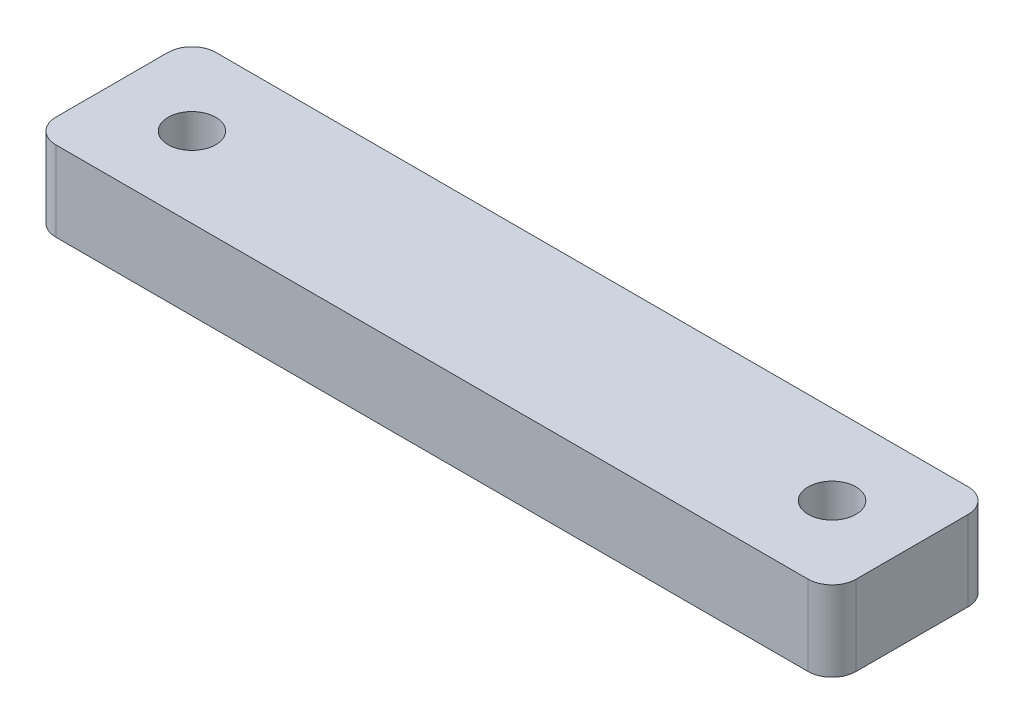
ISO-10303-21;
HEADER;
FILE_DESCRIPTION(('STEP AP214'),'2;1');
FILE_NAME('part.step','',(''),(''),'','','');
FILE_SCHEMA(('AUTOMOTIVE_DESIGN { 1 0 10303 214 1 1 1 1 }'));
ENDSEC;
DATA;
#1=APPLICATION_CONTEXT('core data for automotive mechanical design processes');
#2=APPLICATION_PROTOCOL_DEFINITION('international standard','automotive_design',2000,#1);
#3=PRODUCT_CONTEXT('',#1,'mechanical');
#4=PRODUCT('Part','Part','',(#3));
#5=PRODUCT_RELATED_PRODUCT_CATEGORY('part','',(#4));
#6=PRODUCT_DEFINITION_FORMATION('','',#4);
#7=PRODUCT_DEFINITION_CONTEXT('part definition',#1,'design');
#8=PRODUCT_DEFINITION('design','',#6,#7);
#9=PRODUCT_DEFINITION_SHAPE('','',#8);
#10=(LENGTH_UNIT() NAMED_UNIT(*) SI_UNIT(.MILLI.,.METRE.));
#11=(NAMED_UNIT(*) PLANE_ANGLE_UNIT() SI_UNIT($,.RADIAN.));
#12=(NAMED_UNIT(*) SI_UNIT($,.STERADIAN.) SOLID_ANGLE_UNIT());
#13=UNCERTAINTY_MEASURE_WITH_UNIT(LENGTH_MEASURE(1.E-05),#10,'distance_accuracy_value','');
#14=(GEOMETRIC_REPRESENTATION_CONTEXT(3) GLOBAL_UNCERTAINTY_ASSIGNED_CONTEXT((#13)) GLOBAL_UNIT_ASSIGNED_CONTEXT((#10,
#11,#12)) REPRESENTATION_CONTEXT('',''));
#15=CARTESIAN_POINT('',(0.,0.,0.));
#16=DIRECTION('',(0.,0.,1.));
#17=DIRECTION('',(1.,0.,0.));
#18=AXIS2_PLACEMENT_3D('',#15,#16,#17);
#19=CARTESIAN_POINT('',(123.19,12.7,-3.81));
#20=DIRECTION('',(0.,-1.,0.));
#21=DIRECTION('',(0.,0.,-1.));
#22=AXIS2_PLACEMENT_3D('',#19,#20,#21);
#23=PLANE('',#22);
#24=CARTESIAN_POINT('',(12.7,12.7,-12.7));
#25=DIRECTION('',(0.,1.,0.));
#26=DIRECTION('',(0.,0.,1.));
#27=AXIS2_PLACEMENT_3D('',#24,#25,#26);
#28=CIRCLE('',#27,3.781980970317);
#29=CARTESIAN_POINT('',(12.7,12.7,-8.91801902968301));
#30=VERTEX_POINT('',#29);
#31=EDGE_CURVE('E134',#30,#30,#28,.T.);
#32=ORIENTED_EDGE('',*,*,#31,.F.);
#33=EDGE_LOOP('',(#32));
#34=FACE_BOUND('',#33,.T.);
#35=CARTESIAN_POINT('',(123.19,12.7,-3.81));
#36=DIRECTION('',(0.,1.,0.));
#37=DIRECTION('',(0.,0.,-1.));
#38=AXIS2_PLACEMENT_3D('',#35,#36,#37);
#39=CIRCLE('',#38,3.81);
#40=CARTESIAN_POINT('',(123.19,12.7,0.));
#41=VERTEX_POINT('',#40);
#42=CARTESIAN_POINT('',(127.,12.7,-3.81));
#43=VERTEX_POINT('',#42);
#44=EDGE_CURVE('E145',#41,#43,#39,.T.);
#45=ORIENTED_EDGE('',*,*,#44,.T.);
#46=DIRECTION('',(0.,0.,-1.));
#47=VECTOR('',#46,1.);
#48=CARTESIAN_POINT('',(127.,12.7,-3.81));
#49=LINE('',#48,#47);
#50=CARTESIAN_POINT('',(127.,12.7,-21.59));
#51=VERTEX_POINT('',#50);
#52=EDGE_CURVE('E93',#43,#51,#49,.T.);
#53=ORIENTED_EDGE('',*,*,#52,.T.);
#54=CARTESIAN_POINT('',(123.19,12.7,-21.59));
#55=DIRECTION('',(0.,1.,0.));
#56=DIRECTION('',(0.,0.,1.));
#57=AXIS2_PLACEMENT_3D('',#54,#55,#56);
#58=CIRCLE('',#57,3.81);
#59=CARTESIAN_POINT('',(123.19,12.7,-25.4));
#60=VERTEX_POINT('',#59);
#61=EDGE_CURVE('E160',#51,#60,#58,.T.);
#62=ORIENTED_EDGE('',*,*,#61,.T.);
#63=DIRECTION('',(-1.,0.,0.));
#64=VECTOR('',#63,1.);
#65=CARTESIAN_POINT('',(3.81000000000003,12.7,-25.4));
#66=LINE('',#65,#64);
#67=CARTESIAN_POINT('',(3.81000000000003,12.7,-25.4));
#68=VERTEX_POINT('',#67);
#69=EDGE_CURVE('E173',#60,#68,#66,.T.);
#70=ORIENTED_EDGE('',*,*,#69,.T.);
#71=CARTESIAN_POINT('',(3.81,12.7,-21.59));
#72=DIRECTION('',(0.,1.,0.));
#73=DIRECTION('',(0.,0.,1.));
#74=AXIS2_PLACEMENT_3D('',#71,#72,#73);
#75=CIRCLE('',#74,3.81);
#76=CARTESIAN_POINT('',(0.,12.7,-21.59));
#77=VERTEX_POINT('',#76);
#78=EDGE_CURVE('E112',#68,#77,#75,.T.);
#79=ORIENTED_EDGE('',*,*,#78,.T.);
#80=DIRECTION('',(0.,0.,1.));
#81=VECTOR('',#80,1.);
#82=CARTESIAN_POINT('',(0.,12.7,-3.81000000000003));
#83=LINE('',#82,#81);
#84=CARTESIAN_POINT('',(0.,12.7,-3.81000000000003));
#85=VERTEX_POINT('',#84);
#86=EDGE_CURVE('E106',#77,#85,#83,.T.);
#87=ORIENTED_EDGE('',*,*,#86,.T.);
#88=CARTESIAN_POINT('',(3.81,12.7,-3.81));
#89=DIRECTION('',(0.,1.,0.));
#90=DIRECTION('',(0.,0.,-1.));
#91=AXIS2_PLACEMENT_3D('',#88,#89,#90);
#92=CIRCLE('',#91,3.81);
#93=CARTESIAN_POINT('',(3.81000000000003,12.7,0.));
#94=VERTEX_POINT('',#93);
#95=EDGE_CURVE('E110',#85,#94,#92,.T.);
#96=ORIENTED_EDGE('',*,*,#95,.T.);
#97=DIRECTION('',(1.,0.,0.));
#98=VECTOR('',#97,1.);
#99=CARTESIAN_POINT('',(3.81000000000003,12.7,0.));
#100=LINE('',#99,#98);
#101=EDGE_CURVE('E50',#94,#41,#100,.T.);
#102=ORIENTED_EDGE('',*,*,#101,.T.);
#103=EDGE_LOOP('',(#45,#53,#62,#70,#79,#87,#96,#102));
#104=FACE_BOUND('',#103,.T.);
#105=CARTESIAN_POINT('',(114.3,12.7,-12.7));
#106=DIRECTION('',(0.,1.,0.));
#107=DIRECTION('',(0.,0.,1.));
#108=AXIS2_PLACEMENT_3D('',#105,#106,#107);
#109=CIRCLE('',#108,3.79092647156626);
#110=CARTESIAN_POINT('',(114.3,12.7,-8.90907352843374));
#111=VERTEX_POINT('',#110);
#112=EDGE_CURVE('E182',#111,#111,#109,.T.);
#113=ORIENTED_EDGE('',*,*,#112,.F.);
#114=EDGE_LOOP('',(#113));
#115=FACE_BOUND('',#114,.T.);
#116=ADVANCED_FACE('F33',(#34,#104,#115),#23,.F.);
#117=CARTESIAN_POINT('',(123.19,0.,-3.81));
#118=DIRECTION('',(0.,-1.,0.));
#119=DIRECTION('',(0.,0.,-1.));
#120=AXIS2_PLACEMENT_3D('',#117,#118,#119);
#121=PLANE('',#120);
#122=CARTESIAN_POINT('',(12.7,0.,-12.7));
#123=DIRECTION('',(0.,1.,0.));
#124=DIRECTION('',(0.,0.,1.));
#125=AXIS2_PLACEMENT_3D('',#122,#123,#124);
#126=CIRCLE('',#125,3.781980970317);
#127=CARTESIAN_POINT('',(12.7,0.,-8.91801902968301));
#128=VERTEX_POINT('',#127);
#129=EDGE_CURVE('E179',#128,#128,#126,.T.);
#130=ORIENTED_EDGE('',*,*,#129,.T.);
#131=EDGE_LOOP('',(#130));
#132=FACE_BOUND('',#131,.T.);
#133=CARTESIAN_POINT('',(123.19,0.,-3.81));
#134=DIRECTION('',(0.,1.,0.));
#135=DIRECTION('',(0.,0.,-1.));
#136=AXIS2_PLACEMENT_3D('',#133,#134,#135);
#137=CIRCLE('',#136,3.81);
#138=CARTESIAN_POINT('',(123.19,0.,0.));
#139=VERTEX_POINT('',#138);
#140=CARTESIAN_POINT('',(127.,0.,-3.81));
#141=VERTEX_POINT('',#140);
#142=EDGE_CURVE('E130',#139,#141,#137,.T.);
#143=ORIENTED_EDGE('',*,*,#142,.F.);
#144=DIRECTION('',(1.,0.,0.));
#145=VECTOR('',#144,1.);
#146=CARTESIAN_POINT('',(3.81000000000003,0.,0.));
#147=LINE('',#146,#145);
#148=CARTESIAN_POINT('',(3.81000000000003,0.,0.));
#149=VERTEX_POINT('',#148);
#150=EDGE_CURVE('E85',#149,#139,#147,.T.);
#151=ORIENTED_EDGE('',*,*,#150,.F.);
#152=CARTESIAN_POINT('',(3.81,0.,-3.81));
#153=DIRECTION('',(0.,1.,0.));
#154=DIRECTION('',(0.,0.,-1.));
#155=AXIS2_PLACEMENT_3D('',#152,#153,#154);
#156=CIRCLE('',#155,3.81);
#157=CARTESIAN_POINT('',(0.,0.,-3.81000000000003));
#158=VERTEX_POINT('',#157);
#159=EDGE_CURVE('E79',#158,#149,#156,.T.);
#160=ORIENTED_EDGE('',*,*,#159,.F.);
#161=DIRECTION('',(0.,0.,1.));
#162=VECTOR('',#161,1.);
#163=CARTESIAN_POINT('',(0.,0.,-3.81000000000003));
#164=LINE('',#163,#162);
#165=CARTESIAN_POINT('',(0.,0.,-21.59));
#166=VERTEX_POINT('',#165);
#167=EDGE_CURVE('E120',#166,#158,#164,.T.);
#168=ORIENTED_EDGE('',*,*,#167,.F.);
#169=CARTESIAN_POINT('',(3.81,0.,-21.59));
#170=DIRECTION('',(0.,1.,0.));
#171=DIRECTION('',(0.,0.,1.));
#172=AXIS2_PLACEMENT_3D('',#169,#170,#171);
#173=CIRCLE('',#172,3.81);
#174=CARTESIAN_POINT('',(3.81000000000003,0.,-25.4));
#175=VERTEX_POINT('',#174);
#176=EDGE_CURVE('E140',#175,#166,#173,.T.);
#177=ORIENTED_EDGE('',*,*,#176,.F.);
#178=DIRECTION('',(-1.,0.,0.));
#179=VECTOR('',#178,1.);
#180=CARTESIAN_POINT('',(3.81000000000003,0.,-25.4));
#181=LINE('',#180,#179);
#182=CARTESIAN_POINT('',(123.19,0.,-25.4));
#183=VERTEX_POINT('',#182);
#184=EDGE_CURVE('E138',#183,#175,#181,.T.);
#185=ORIENTED_EDGE('',*,*,#184,.F.);
#186=CARTESIAN_POINT('',(123.19,0.,-21.59));
#187=DIRECTION('',(0.,1.,0.));
#188=DIRECTION('',(0.,0.,1.));
#189=AXIS2_PLACEMENT_3D('',#186,#187,#188);
#190=CIRCLE('',#189,3.81);
#191=CARTESIAN_POINT('',(127.,0.,-21.59));
#192=VERTEX_POINT('',#191);
#193=EDGE_CURVE('E136',#192,#183,#190,.T.);
#194=ORIENTED_EDGE('',*,*,#193,.F.);
#195=DIRECTION('',(0.,0.,-1.));
#196=VECTOR('',#195,1.);
#197=CARTESIAN_POINT('',(127.,0.,-3.81));
#198=LINE('',#197,#196);
#199=EDGE_CURVE('E133',#141,#192,#198,.T.);
#200=ORIENTED_EDGE('',*,*,#199,.F.);
#201=EDGE_LOOP('',(#143,#151,#160,#168,#177,#185,#194,#200));
#202=FACE_BOUND('',#201,.T.);
#203=CARTESIAN_POINT('',(114.3,0.,-12.7));
#204=DIRECTION('',(0.,1.,0.));
#205=DIRECTION('',(0.,0.,1.));
#206=AXIS2_PLACEMENT_3D('',#203,#204,#205);
#207=CIRCLE('',#206,3.79092647156626);
#208=CARTESIAN_POINT('',(114.3,0.,-8.90907352843374));
#209=VERTEX_POINT('',#208);
#210=EDGE_CURVE('E185',#209,#209,#207,.T.);
#211=ORIENTED_EDGE('',*,*,#210,.T.);
#212=EDGE_LOOP('',(#211));
#213=FACE_BOUND('',#212,.T.);
#214=ADVANCED_FACE('F164',(#132,#202,#213),#121,.T.);
#215=CARTESIAN_POINT('',(123.19,12.7,-3.81));
#216=DIRECTION('',(0.,-1.,0.));
#217=DIRECTION('',(0.,0.,-1.));
#218=AXIS2_PLACEMENT_3D('',#215,#216,#217);
#219=CYLINDRICAL_SURFACE('',#218,3.81);
#220=ORIENTED_EDGE('',*,*,#142,.T.);
#221=DIRECTION('',(0.,-1.,0.));
#222=VECTOR('',#221,1.);
#223=CARTESIAN_POINT('',(127.,12.7,-3.81));
#224=LINE('',#223,#222);
#225=EDGE_CURVE('E11',#43,#141,#224,.T.);
#226=ORIENTED_EDGE('',*,*,#225,.F.);
#227=ORIENTED_EDGE('',*,*,#44,.F.);
#228=DIRECTION('',(0.,-1.,0.));
#229=VECTOR('',#228,1.);
#230=CARTESIAN_POINT('',(123.19,12.7,0.));
#231=LINE('',#230,#229);
#232=EDGE_CURVE('E126',#41,#139,#231,.T.);
#233=ORIENTED_EDGE('',*,*,#232,.T.);
#234=EDGE_LOOP('',(#220,#226,#227,#233));
#235=FACE_BOUND('',#234,.T.);
#236=ADVANCED_FACE('F35',(#235),#219,.T.);
#237=CARTESIAN_POINT('',(127.,12.7,-3.81));
#238=DIRECTION('',(-1.,0.,0.));
#239=DIRECTION('',(0.,0.,1.));
#240=AXIS2_PLACEMENT_3D('',#237,#238,#239);
#241=PLANE('',#240);
#242=ORIENTED_EDGE('',*,*,#199,.T.);
#243=DIRECTION('',(0.,-1.,0.));
#244=VECTOR('',#243,1.);
#245=CARTESIAN_POINT('',(127.,12.7,-21.59));
#246=LINE('',#245,#244);
#247=EDGE_CURVE('E42',#51,#192,#246,.T.);
#248=ORIENTED_EDGE('',*,*,#247,.F.);
#249=ORIENTED_EDGE('',*,*,#52,.F.);
#250=ORIENTED_EDGE('',*,*,#225,.T.);
#251=EDGE_LOOP('',(#242,#248,#249,#250));
#252=FACE_BOUND('',#251,.T.);
#253=ADVANCED_FACE('F218',(#252),#241,.F.);
#254=CARTESIAN_POINT('',(123.19,12.7,-21.59));
#255=DIRECTION('',(0.,-1.,0.));
#256=DIRECTION('',(0.,0.,-1.));
#257=AXIS2_PLACEMENT_3D('',#254,#255,#256);
#258=CYLINDRICAL_SURFACE('',#257,3.81);
#259=ORIENTED_EDGE('',*,*,#193,.T.);
#260=DIRECTION('',(0.,-1.,0.));
#261=VECTOR('',#260,1.);
#262=CARTESIAN_POINT('',(123.19,12.7,-25.4));
#263=LINE('',#262,#261);
#264=EDGE_CURVE('E152',#60,#183,#263,.T.);
#265=ORIENTED_EDGE('',*,*,#264,.F.);
#266=ORIENTED_EDGE('',*,*,#61,.F.);
#267=ORIENTED_EDGE('',*,*,#247,.T.);
#268=EDGE_LOOP('',(#259,#265,#266,#267));
#269=FACE_BOUND('',#268,.T.);
#270=ADVANCED_FACE('F158',(#269),#258,.T.);
#271=CARTESIAN_POINT('',(3.81000000000003,12.7,-25.4));
#272=DIRECTION('',(0.,0.,1.));
#273=DIRECTION('',(1.,0.,0.));
#274=AXIS2_PLACEMENT_3D('',#271,#272,#273);
#275=PLANE('',#274);
#276=ORIENTED_EDGE('',*,*,#184,.T.);
#277=DIRECTION('',(0.,-1.,0.));
#278=VECTOR('',#277,1.);
#279=CARTESIAN_POINT('',(3.81000000000003,12.7,-25.4));
#280=LINE('',#279,#278);
#281=EDGE_CURVE('E149',#68,#175,#280,.T.);
#282=ORIENTED_EDGE('',*,*,#281,.F.);
#283=ORIENTED_EDGE('',*,*,#69,.F.);
#284=ORIENTED_EDGE('',*,*,#264,.T.);
#285=EDGE_LOOP('',(#276,#282,#283,#284));
#286=FACE_BOUND('',#285,.T.);
#287=ADVANCED_FACE('F169',(#286),#275,.F.);
#288=CARTESIAN_POINT('',(3.81,12.7,-21.59));
#289=DIRECTION('',(0.,-1.,0.));
#290=DIRECTION('',(0.,0.,-1.));
#291=AXIS2_PLACEMENT_3D('',#288,#289,#290);
#292=CYLINDRICAL_SURFACE('',#291,3.81);
#293=ORIENTED_EDGE('',*,*,#176,.T.);
#294=DIRECTION('',(0.,-1.,0.));
#295=VECTOR('',#294,1.);
#296=CARTESIAN_POINT('',(0.,12.7,-21.59));
#297=LINE('',#296,#295);
#298=EDGE_CURVE('E121',#77,#166,#297,.T.);
#299=ORIENTED_EDGE('',*,*,#298,.F.);
#300=ORIENTED_EDGE('',*,*,#78,.F.);
#301=ORIENTED_EDGE('',*,*,#281,.T.);
#302=EDGE_LOOP('',(#293,#299,#300,#301));
#303=FACE_BOUND('',#302,.T.);
#304=ADVANCED_FACE('F172',(#303),#292,.T.);
#305=CARTESIAN_POINT('',(0.,12.7,-3.81000000000003));
#306=DIRECTION('',(1.,0.,0.));
#307=DIRECTION('',(0.,0.,-1.));
#308=AXIS2_PLACEMENT_3D('',#305,#306,#307);
#309=PLANE('',#308);
#310=ORIENTED_EDGE('',*,*,#167,.T.);
#311=DIRECTION('',(0.,-1.,0.));
#312=VECTOR('',#311,1.);
#313=CARTESIAN_POINT('',(0.,12.7,-3.81000000000003));
#314=LINE('',#313,#312);
#315=EDGE_CURVE('E117',#85,#158,#314,.T.);
#316=ORIENTED_EDGE('',*,*,#315,.F.);
#317=ORIENTED_EDGE('',*,*,#86,.F.);
#318=ORIENTED_EDGE('',*,*,#298,.T.);
#319=EDGE_LOOP('',(#310,#316,#317,#318));
#320=FACE_BOUND('',#319,.T.);
#321=ADVANCED_FACE('F118',(#320),#309,.F.);
#322=CARTESIAN_POINT('',(3.81,12.7,-3.81));
#323=DIRECTION('',(0.,-1.,0.));
#324=DIRECTION('',(0.,0.,-1.));
#325=AXIS2_PLACEMENT_3D('',#322,#323,#324);
#326=CYLINDRICAL_SURFACE('',#325,3.81);
#327=ORIENTED_EDGE('',*,*,#159,.T.);
#328=DIRECTION('',(0.,-1.,0.));
#329=VECTOR('',#328,1.);
#330=CARTESIAN_POINT('',(3.81000000000003,12.7,0.));
#331=LINE('',#330,#329);
#332=EDGE_CURVE('E122',#94,#149,#331,.T.);
#333=ORIENTED_EDGE('',*,*,#332,.F.);
#334=ORIENTED_EDGE('',*,*,#95,.F.);
#335=ORIENTED_EDGE('',*,*,#315,.T.);
#336=EDGE_LOOP('',(#327,#333,#334,#335));
#337=FACE_BOUND('',#336,.T.);
#338=ADVANCED_FACE('F124',(#337),#326,.T.);
#339=CARTESIAN_POINT('',(3.81000000000003,12.7,0.));
#340=DIRECTION('',(0.,0.,-1.));
#341=DIRECTION('',(-1.,0.,0.));
#342=AXIS2_PLACEMENT_3D('',#339,#340,#341);
#343=PLANE('',#342);
#344=ORIENTED_EDGE('',*,*,#150,.T.);
#345=ORIENTED_EDGE('',*,*,#232,.F.);
#346=ORIENTED_EDGE('',*,*,#101,.F.);
#347=ORIENTED_EDGE('',*,*,#332,.T.);
#348=EDGE_LOOP('',(#344,#345,#346,#347));
#349=FACE_BOUND('',#348,.T.);
#350=ADVANCED_FACE('F206',(#349),#343,.F.);
#351=CARTESIAN_POINT('',(12.7,12.7,-12.7));
#352=DIRECTION('',(0.,-1.,0.));
#353=DIRECTION('',(0.,0.,-1.));
#354=AXIS2_PLACEMENT_3D('',#351,#352,#353);
#355=CYLINDRICAL_SURFACE('',#354,3.781980970317);
#356=ORIENTED_EDGE('',*,*,#31,.T.);
#357=EDGE_LOOP('',(#356));
#358=FACE_BOUND('',#357,.T.);
#359=ORIENTED_EDGE('',*,*,#129,.F.);
#360=EDGE_LOOP('',(#359));
#361=FACE_BOUND('',#360,.T.);
#362=ADVANCED_FACE('F203',(#358,#361),#355,.F.);
#363=CARTESIAN_POINT('',(114.3,12.7,-12.7));
#364=DIRECTION('',(0.,-1.,0.));
#365=DIRECTION('',(0.,0.,-1.));
#366=AXIS2_PLACEMENT_3D('',#363,#364,#365);
#367=CYLINDRICAL_SURFACE('',#366,3.79092647156626);
#368=ORIENTED_EDGE('',*,*,#112,.T.);
#369=EDGE_LOOP('',(#368));
#370=FACE_BOUND('',#369,.T.);
#371=ORIENTED_EDGE('',*,*,#210,.F.);
#372=EDGE_LOOP('',(#371));
#373=FACE_BOUND('',#372,.T.);
#374=ADVANCED_FACE('F191',(#370,#373),#367,.F.);
#375=CLOSED_SHELL('',(#116,#214,#236,#253,#270,#287,#304,#321,#338,#350,#362,#374));
#376=MANIFOLD_SOLID_BREP('B2',#375);
#377=ADVANCED_BREP_SHAPE_REPRESENTATION('',(#18,#376),#14);
#378=SHAPE_DEFINITION_REPRESENTATION(#9,#377);
ENDSEC;
END-ISO-10303-21;
